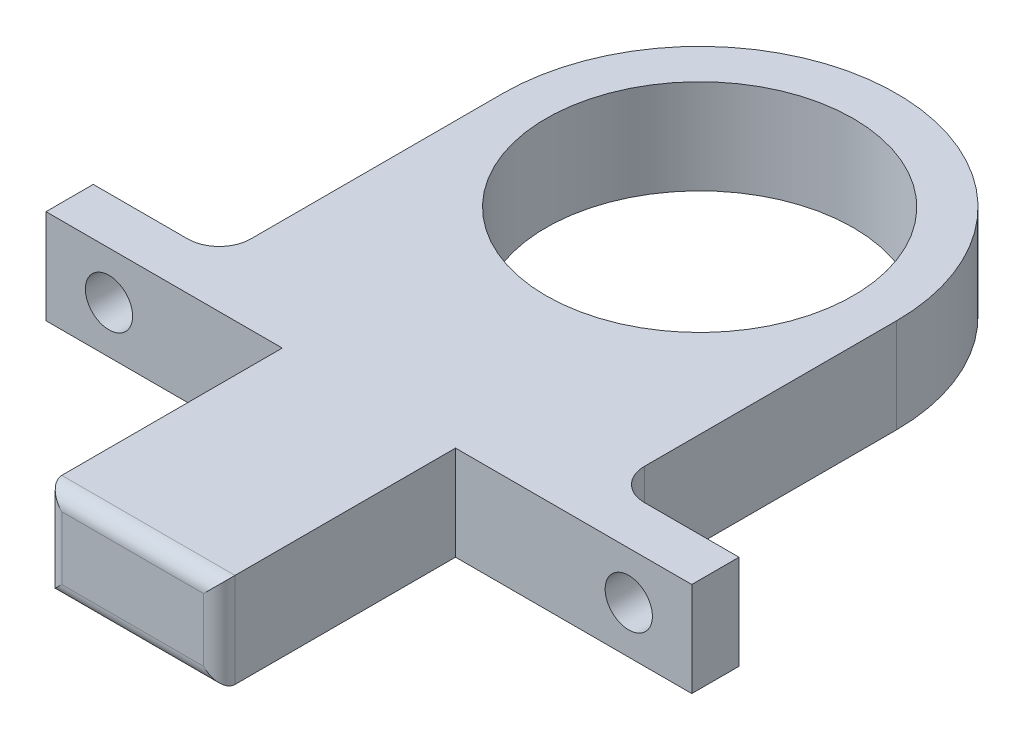
ISO-10303-21;
HEADER;
FILE_DESCRIPTION(('STEP AP214'),'2;1');
FILE_NAME('part.step','',(''),(''),'','','');
FILE_SCHEMA(('AUTOMOTIVE_DESIGN { 1 0 10303 214 1 1 1 1 }'));
ENDSEC;
DATA;
#1=APPLICATION_CONTEXT('core data for automotive mechanical design processes');
#2=APPLICATION_PROTOCOL_DEFINITION('international standard','automotive_design',2000,#1);
#3=PRODUCT_CONTEXT('',#1,'mechanical');
#4=PRODUCT('Part','Part','',(#3));
#5=PRODUCT_RELATED_PRODUCT_CATEGORY('part','',(#4));
#6=PRODUCT_DEFINITION_FORMATION('','',#4);
#7=PRODUCT_DEFINITION_CONTEXT('part definition',#1,'design');
#8=PRODUCT_DEFINITION('design','',#6,#7);
#9=PRODUCT_DEFINITION_SHAPE('','',#8);
#10=(LENGTH_UNIT() NAMED_UNIT(*) SI_UNIT(.MILLI.,.METRE.));
#11=(NAMED_UNIT(*) PLANE_ANGLE_UNIT() SI_UNIT($,.RADIAN.));
#12=(NAMED_UNIT(*) SI_UNIT($,.STERADIAN.) SOLID_ANGLE_UNIT());
#13=UNCERTAINTY_MEASURE_WITH_UNIT(LENGTH_MEASURE(1.E-05),#10,'distance_accuracy_value','');
#14=(GEOMETRIC_REPRESENTATION_CONTEXT(3) GLOBAL_UNCERTAINTY_ASSIGNED_CONTEXT((#13)) GLOBAL_UNIT_ASSIGNED_CONTEXT((#10,
#11,#12)) REPRESENTATION_CONTEXT('',''));
#15=CARTESIAN_POINT('',(0.,0.,0.));
#16=DIRECTION('',(0.,0.,1.));
#17=DIRECTION('',(1.,0.,0.));
#18=AXIS2_PLACEMENT_3D('',#15,#16,#17);
#19=CARTESIAN_POINT('',(14.5,6.,16.));
#20=DIRECTION('',(0.,-1.,0.));
#21=DIRECTION('',(0.,0.,-1.));
#22=AXIS2_PLACEMENT_3D('',#19,#20,#21);
#23=CYLINDRICAL_SURFACE('',#22,2.);
#24=CARTESIAN_POINT('',(14.5,0.763932022500208,18.));
#25=CARTESIAN_POINT('',(14.4360548230811,0.821114452196651,17.999991001011));
#26=CARTESIAN_POINT('',(14.3746747194877,0.880963558778248,17.9969360380857));
#27=CARTESIAN_POINT('',(14.2575309544641,1.00535526899634,17.9861189862143));
#28=CARTESIAN_POINT('',(14.201757724223,1.0698895410455,17.9783650812312));
#29=CARTESIAN_POINT('',(14.0436299233813,1.269403254821,17.9501723427297));
#30=CARTESIAN_POINT('',(13.9500090538812,1.41070634031406,17.9247828447302));
#31=CARTESIAN_POINT('',(13.7964859030759,1.69085008688568,17.8737436355664));
#32=CARTESIAN_POINT('',(13.734085828235,1.8284115592227,17.8483970285937));
#33=CARTESIAN_POINT('',(13.6304231456783,2.11216111679814,17.801968583353));
#34=CARTESIAN_POINT('',(13.5891595639111,2.25834880416089,17.7808865485842));
#35=CARTESIAN_POINT('',(13.5424444149349,2.4900756745183,17.7559694924004));
#36=CARTESIAN_POINT('',(13.5292266928438,2.57373721422762,17.748632542817));
#37=CARTESIAN_POINT('',(13.5099018193217,2.74214941389093,17.7377671781259));
#38=CARTESIAN_POINT('',(13.5037946607241,2.82690007274712,17.7342387591796));
#39=CARTESIAN_POINT('',(13.4988015755461,2.99661169740436,17.731360497232));
#40=CARTESIAN_POINT('',(13.4999096596755,3.08157243027201,17.7320071885158));
#41=CARTESIAN_POINT('',(13.509312145588,3.25095820228575,17.7374022988605));
#42=CARTESIAN_POINT('',(13.5176061598787,3.33538327006965,17.7421504967527));
#43=CARTESIAN_POINT('',(13.5397620052276,3.49240842726077,17.7544457420635));
#44=CARTESIAN_POINT('',(13.5527933449962,3.56516149030752,17.7615661760176));
#45=CARTESIAN_POINT('',(13.584118008221,3.70927623722187,17.7780525456863));
#46=CARTESIAN_POINT('',(13.6024129711344,3.78063748017411,17.7874191808721));
#47=CARTESIAN_POINT('',(13.6650413131257,3.99231248535498,17.8179718344291));
#48=CARTESIAN_POINT('',(13.717093012055,4.13004212413035,17.8415941468649));
#49=CARTESIAN_POINT('',(13.8473106981414,4.41053543180313,17.8919174442979));
#50=CARTESIAN_POINT('',(13.9276616864121,4.55228238725443,17.9186791253345));
#51=CARTESIAN_POINT('',(14.0649005688885,4.75410782817598,17.9526651833944));
#52=CARTESIAN_POINT('',(14.1133615629979,4.81950905689693,17.962958788252));
#53=CARTESIAN_POINT('',(14.2156612628685,4.94638688699547,17.9803633693212));
#54=CARTESIAN_POINT('',(14.2694953446185,5.00786678958472,17.9874770537309));
#55=CARTESIAN_POINT('',(14.3536727958229,5.09640515774771,17.9948357571476));
#56=CARTESIAN_POINT('',(14.382125595261,5.12514571473681,17.9967350315346));
#57=CARTESIAN_POINT('',(14.4402003405923,5.18148166800703,17.9993170113589));
#58=CARTESIAN_POINT('',(14.4698223948428,5.20907695766524,17.9999996037718));
#59=CARTESIAN_POINT('',(14.5,5.23606797749979,18.));
#60=B_SPLINE_CURVE_WITH_KNOTS('',3,(#24,#25,#26,#27,#28,#29,#30,#31,#32,#33,#34,#35,#36,#37,#38,
#39,#40,#41,#42,#43,#44,#45,#46,#47,#48,#49,#50,#51,#52,#53,#54,#55,#56,#57,#58,#59),
.UNSPECIFIED.,.F.,.F.,(4,2,2,2,2,2,2,2,2,2,2,2,2,2,2,2,2,4),(0.,0.257003095036121,
0.513559859167406,1.02485284203966,1.4828396357824,1.94080532182222,2.19552218723163,
2.45023879591204,2.70474399422835,2.95923546951889,3.18175175856397,3.40433742978967,
3.85003679324152,4.34303172260549,4.58891756679051,4.83459359999334,4.95600984354938,
5.07743736555965),.UNSPECIFIED.);
#61=CARTESIAN_POINT('',(14.5,0.763932022500208,18.));
#62=VERTEX_POINT('',#61);
#63=CARTESIAN_POINT('',(14.5,5.23606797749979,18.));
#64=VERTEX_POINT('',#63);
#65=EDGE_CURVE('E165',#62,#64,#60,.T.);
#66=ORIENTED_EDGE('',*,*,#65,.F.);
#67=DIRECTION('',(0.,-1.,0.));
#68=VECTOR('',#67,1.);
#69=CARTESIAN_POINT('',(14.5,6.,18.));
#70=LINE('',#69,#68);
#71=CARTESIAN_POINT('',(14.5,0.,18.));
#72=VERTEX_POINT('',#71);
#73=EDGE_CURVE('E176',#62,#72,#70,.T.);
#74=ORIENTED_EDGE('',*,*,#73,.T.);
#75=CARTESIAN_POINT('',(14.5,0.,16.));
#76=DIRECTION('',(0.,1.,0.));
#77=DIRECTION('',(0.,0.,1.));
#78=AXIS2_PLACEMENT_3D('',#75,#76,#77);
#79=CIRCLE('',#78,2.);
#80=CARTESIAN_POINT('',(12.5,0.,16.));
#81=VERTEX_POINT('',#80);
#82=EDGE_CURVE('E390',#72,#81,#79,.F.);
#83=ORIENTED_EDGE('',*,*,#82,.T.);
#84=DIRECTION('',(0.,-1.,0.));
#85=VECTOR('',#84,1.);
#86=CARTESIAN_POINT('',(12.5,6.,16.));
#87=LINE('',#86,#85);
#88=CARTESIAN_POINT('',(12.5,6.,16.));
#89=VERTEX_POINT('',#88);
#90=EDGE_CURVE('E186',#89,#81,#87,.T.);
#91=ORIENTED_EDGE('',*,*,#90,.F.);
#92=CARTESIAN_POINT('',(14.5,6.,16.));
#93=DIRECTION('',(0.,1.,0.));
#94=DIRECTION('',(0.,0.,1.));
#95=AXIS2_PLACEMENT_3D('',#92,#93,#94);
#96=CIRCLE('',#95,2.);
#97=CARTESIAN_POINT('',(14.5,6.,18.));
#98=VERTEX_POINT('',#97);
#99=EDGE_CURVE('E364',#98,#89,#96,.F.);
#100=ORIENTED_EDGE('',*,*,#99,.F.);
#101=EDGE_CURVE('E179',#98,#64,#70,.T.);
#102=ORIENTED_EDGE('',*,*,#101,.T.);
#103=EDGE_LOOP('',(#66,#74,#83,#91,#100,#102));
#104=FACE_BOUND('',#103,.T.);
#105=ADVANCED_FACE('F35',(#104),#23,.F.);
#106=CARTESIAN_POINT('',(-14.5,6.,16.));
#107=DIRECTION('',(0.,-1.,0.));
#108=DIRECTION('',(0.,0.,-1.));
#109=AXIS2_PLACEMENT_3D('',#106,#107,#108);
#110=CYLINDRICAL_SURFACE('',#109,2.);
#111=DIRECTION('',(0.,-1.,0.));
#112=VECTOR('',#111,1.);
#113=CARTESIAN_POINT('',(-14.5,6.,18.));
#114=LINE('',#113,#112);
#115=CARTESIAN_POINT('',(-14.5,0.76393202250021,18.));
#116=VERTEX_POINT('',#115);
#117=CARTESIAN_POINT('',(-14.5,0.,18.));
#118=VERTEX_POINT('',#117);
#119=EDGE_CURVE('E202',#116,#118,#114,.T.);
#120=ORIENTED_EDGE('',*,*,#119,.F.);
#121=CARTESIAN_POINT('',(-14.5,0.763932022500211,18.));
#122=CARTESIAN_POINT('',(-14.4360548230811,0.821114452196653,17.999991001011));
#123=CARTESIAN_POINT('',(-14.3746747194877,0.88096355877825,17.9969360380857));
#124=CARTESIAN_POINT('',(-14.2575309544641,1.00535526899635,17.9861189862143));
#125=CARTESIAN_POINT('',(-14.201757724223,1.0698895410455,17.9783650812312));
#126=CARTESIAN_POINT('',(-14.0436299233813,1.269403254821,17.9501723427297));
#127=CARTESIAN_POINT('',(-13.9500090538812,1.41070634031406,17.9247828447302));
#128=CARTESIAN_POINT('',(-13.7964859030759,1.69085008688568,17.8737436355664));
#129=CARTESIAN_POINT('',(-13.734085828235,1.8284115592227,17.8483970285937));
#130=CARTESIAN_POINT('',(-13.6304231456783,2.11216111679815,17.801968583353));
#131=CARTESIAN_POINT('',(-13.5891595639111,2.2583488041609,17.7808865485842));
#132=CARTESIAN_POINT('',(-13.5424444149349,2.4900756745183,17.7559694924004));
#133=CARTESIAN_POINT('',(-13.5292266928438,2.57373721422762,17.748632542817));
#134=CARTESIAN_POINT('',(-13.5099018193217,2.74214941389093,17.7377671781259));
#135=CARTESIAN_POINT('',(-13.5037946607241,2.82690007274712,17.7342387591796));
#136=CARTESIAN_POINT('',(-13.4988015755461,2.99661169740436,17.731360497232));
#137=CARTESIAN_POINT('',(-13.4999096596755,3.08157243027202,17.7320071885158));
#138=CARTESIAN_POINT('',(-13.509312145588,3.25095820228576,17.7374022988605));
#139=CARTESIAN_POINT('',(-13.5176061598787,3.33538327006965,17.7421504967527));
#140=CARTESIAN_POINT('',(-13.5397620052276,3.49240842726077,17.7544457420635));
#141=CARTESIAN_POINT('',(-13.5527933449962,3.56516149030752,17.7615661760176));
#142=CARTESIAN_POINT('',(-13.584118008221,3.70927623722188,17.7780525456863));
#143=CARTESIAN_POINT('',(-13.6024129711344,3.78063748017412,17.7874191808721));
#144=CARTESIAN_POINT('',(-13.6650413131257,3.99231248535499,17.8179718344291));
#145=CARTESIAN_POINT('',(-13.717093012055,4.13004212413036,17.8415941468649));
#146=CARTESIAN_POINT('',(-13.8473106981414,4.41053543180314,17.8919174442979));
#147=CARTESIAN_POINT('',(-13.9276616864121,4.55228238725444,17.9186791253345));
#148=CARTESIAN_POINT('',(-14.0649005688885,4.75410782817598,17.9526651833944));
#149=CARTESIAN_POINT('',(-14.1133615629979,4.81950905689693,17.962958788252));
#150=CARTESIAN_POINT('',(-14.2156612628685,4.94638688699547,17.9803633693212));
#151=CARTESIAN_POINT('',(-14.2694953446185,5.00786678958472,17.9874770537309));
#152=CARTESIAN_POINT('',(-14.3536727958229,5.09640515774772,17.9948357571476));
#153=CARTESIAN_POINT('',(-14.382125595261,5.12514571473681,17.9967350315346));
#154=CARTESIAN_POINT('',(-14.4402003405923,5.18148166800703,17.9993170113589));
#155=CARTESIAN_POINT('',(-14.4698223948428,5.20907695766524,17.9999996037718));
#156=CARTESIAN_POINT('',(-14.5,5.23606797749979,18.));
#157=B_SPLINE_CURVE_WITH_KNOTS('',3,(#121,#122,#123,#124,#125,#126,#127,#128,#129,#130,#131,
#132,#133,#134,#135,#136,#137,#138,#139,#140,#141,#142,#143,#144,#145,#146,#147,#148,#149,#150,
#151,#152,#153,#154,#155,#156),.UNSPECIFIED.,.F.,.F.,(4,2,2,2,2,2,2,2,2,2,2,2,2,2,2,2,2,4),(0.,
0.257003095036121,0.513559859167407,1.02485284203966,1.4828396357824,1.94080532182222,
2.19552218723163,2.45023879591204,2.70474399422835,2.95923546951889,3.18175175856396,
3.40433742978967,3.85003679324152,4.34303172260549,4.58891756679051,4.83459359999334,
4.95600984354938,5.07743736555964),.UNSPECIFIED.);
#158=CARTESIAN_POINT('',(-14.5,5.23606797749979,18.));
#159=VERTEX_POINT('',#158);
#160=EDGE_CURVE('E170',#116,#159,#157,.T.);
#161=ORIENTED_EDGE('',*,*,#160,.T.);
#162=CARTESIAN_POINT('',(-14.5,6.,18.));
#163=VERTEX_POINT('',#162);
#164=EDGE_CURVE('E203',#163,#159,#114,.T.);
#165=ORIENTED_EDGE('',*,*,#164,.F.);
#166=CARTESIAN_POINT('',(-14.5,6.,16.));
#167=DIRECTION('',(0.,1.,0.));
#168=DIRECTION('',(0.,0.,1.));
#169=AXIS2_PLACEMENT_3D('',#166,#167,#168);
#170=CIRCLE('',#169,2.);
#171=CARTESIAN_POINT('',(-12.5,6.,16.));
#172=VERTEX_POINT('',#171);
#173=EDGE_CURVE('E349',#163,#172,#170,.T.);
#174=ORIENTED_EDGE('',*,*,#173,.T.);
#175=DIRECTION('',(0.,-1.,0.));
#176=VECTOR('',#175,1.);
#177=CARTESIAN_POINT('',(-12.5,6.,16.));
#178=LINE('',#177,#176);
#179=CARTESIAN_POINT('',(-12.5,0.,16.));
#180=VERTEX_POINT('',#179);
#181=EDGE_CURVE('E206',#172,#180,#178,.T.);
#182=ORIENTED_EDGE('',*,*,#181,.T.);
#183=CARTESIAN_POINT('',(-14.5,0.,16.));
#184=DIRECTION('',(0.,1.,0.));
#185=DIRECTION('',(0.,0.,1.));
#186=AXIS2_PLACEMENT_3D('',#183,#184,#185);
#187=CIRCLE('',#186,2.);
#188=EDGE_CURVE('E375',#118,#180,#187,.T.);
#189=ORIENTED_EDGE('',*,*,#188,.F.);
#190=EDGE_LOOP('',(#120,#161,#165,#174,#182,#189));
#191=FACE_BOUND('',#190,.T.);
#192=ADVANCED_FACE('F272',(#191),#110,.F.);
#193=CARTESIAN_POINT('',(0.,6.,0.));
#194=DIRECTION('',(0.,-1.,0.));
#195=DIRECTION('',(0.,0.,-1.));
#196=AXIS2_PLACEMENT_3D('',#193,#194,#195);
#197=CYLINDRICAL_SURFACE('',#196,9.75);
#198=CARTESIAN_POINT('',(0.,6.,0.));
#199=DIRECTION('',(0.,1.,0.));
#200=DIRECTION('',(0.,0.,1.));
#201=AXIS2_PLACEMENT_3D('',#198,#199,#200);
#202=CIRCLE('',#201,9.75);
#203=CARTESIAN_POINT('',(0.,6.,9.75));
#204=VERTEX_POINT('',#203);
#205=EDGE_CURVE('E189',#204,#204,#202,.T.);
#206=ORIENTED_EDGE('',*,*,#205,.T.);
#207=EDGE_LOOP('',(#206));
#208=FACE_BOUND('',#207,.T.);
#209=CARTESIAN_POINT('',(0.,0.,0.));
#210=DIRECTION('',(0.,1.,0.));
#211=DIRECTION('',(0.,0.,1.));
#212=AXIS2_PLACEMENT_3D('',#209,#210,#211);
#213=CIRCLE('',#212,9.75);
#214=CARTESIAN_POINT('',(0.,0.,9.75));
#215=VERTEX_POINT('',#214);
#216=EDGE_CURVE('E345',#215,#215,#213,.T.);
#217=ORIENTED_EDGE('',*,*,#216,.F.);
#218=EDGE_LOOP('',(#217));
#219=FACE_BOUND('',#218,.T.);
#220=ADVANCED_FACE('F300',(#208,#219),#197,.F.);
#221=CARTESIAN_POINT('',(0.,6.,18.));
#222=DIRECTION('',(0.,0.,1.));
#223=DIRECTION('',(1.,0.,0.));
#224=AXIS2_PLACEMENT_3D('',#221,#222,#223);
#225=PLANE('',#224);
#226=DIRECTION('',(-1.,0.,0.));
#227=VECTOR('',#226,1.);
#228=CARTESIAN_POINT('',(0.,0.,18.));
#229=LINE('',#228,#227);
#230=CARTESIAN_POINT('',(20.5,0.,18.));
#231=VERTEX_POINT('',#230);
#232=EDGE_CURVE('E185',#231,#72,#229,.T.);
#233=ORIENTED_EDGE('',*,*,#232,.T.);
#234=ORIENTED_EDGE('',*,*,#73,.F.);
#235=CARTESIAN_POINT('',(16.5,3.,18.));
#236=DIRECTION('',(0.,0.,-1.));
#237=DIRECTION('',(-1.,0.,0.));
#238=AXIS2_PLACEMENT_3D('',#235,#236,#237);
#239=CIRCLE('',#238,3.);
#240=EDGE_CURVE('E162',#62,#64,#239,.T.);
#241=ORIENTED_EDGE('',*,*,#240,.T.);
#242=ORIENTED_EDGE('',*,*,#101,.F.);
#243=DIRECTION('',(-1.,0.,0.));
#244=VECTOR('',#243,1.);
#245=CARTESIAN_POINT('',(0.,6.,18.));
#246=LINE('',#245,#244);
#247=CARTESIAN_POINT('',(20.5,6.,18.));
#248=VERTEX_POINT('',#247);
#249=EDGE_CURVE('E362',#248,#98,#246,.T.);
#250=ORIENTED_EDGE('',*,*,#249,.F.);
#251=DIRECTION('',(0.,-1.,0.));
#252=VECTOR('',#251,1.);
#253=CARTESIAN_POINT('',(20.5,6.,18.));
#254=LINE('',#253,#252);
#255=EDGE_CURVE('E188',#248,#231,#254,.T.);
#256=ORIENTED_EDGE('',*,*,#255,.T.);
#257=EDGE_LOOP('',(#233,#234,#241,#242,#250,#256));
#258=FACE_BOUND('',#257,.T.);
#259=CARTESIAN_POINT('',(16.5,3.,18.));
#260=DIRECTION('',(0.,0.,1.));
#261=DIRECTION('',(1.,0.,0.));
#262=AXIS2_PLACEMENT_3D('',#259,#260,#261);
#263=CIRCLE('',#262,1.5);
#264=CARTESIAN_POINT('',(18.,3.,18.));
#265=VERTEX_POINT('',#264);
#266=EDGE_CURVE('E222',#265,#265,#263,.T.);
#267=ORIENTED_EDGE('',*,*,#266,.T.);
#268=EDGE_LOOP('',(#267));
#269=FACE_BOUND('',#268,.T.);
#270=ADVANCED_FACE('F182',(#258,#269),#225,.F.);
#271=CARTESIAN_POINT('',(0.,6.,18.));
#272=DIRECTION('',(0.,0.,-1.));
#273=DIRECTION('',(-1.,0.,0.));
#274=AXIS2_PLACEMENT_3D('',#271,#272,#273);
#275=PLANE('',#274);
#276=DIRECTION('',(1.,0.,0.));
#277=VECTOR('',#276,1.);
#278=CARTESIAN_POINT('',(0.,6.,18.));
#279=LINE('',#278,#277);
#280=CARTESIAN_POINT('',(-20.5,6.,18.));
#281=VERTEX_POINT('',#280);
#282=EDGE_CURVE('E329',#281,#163,#279,.T.);
#283=ORIENTED_EDGE('',*,*,#282,.T.);
#284=ORIENTED_EDGE('',*,*,#164,.T.);
#285=CARTESIAN_POINT('',(-16.5,3.,18.));
#286=DIRECTION('',(0.,0.,-1.));
#287=DIRECTION('',(-1.,0.,0.));
#288=AXIS2_PLACEMENT_3D('',#285,#286,#287);
#289=CIRCLE('',#288,3.);
#290=EDGE_CURVE('E171',#159,#116,#289,.T.);
#291=ORIENTED_EDGE('',*,*,#290,.T.);
#292=ORIENTED_EDGE('',*,*,#119,.T.);
#293=DIRECTION('',(1.,0.,0.));
#294=VECTOR('',#293,1.);
#295=CARTESIAN_POINT('',(0.,0.,18.));
#296=LINE('',#295,#294);
#297=CARTESIAN_POINT('',(-20.5,0.,18.));
#298=VERTEX_POINT('',#297);
#299=EDGE_CURVE('E378',#298,#118,#296,.T.);
#300=ORIENTED_EDGE('',*,*,#299,.F.);
#301=DIRECTION('',(0.,-1.,0.));
#302=VECTOR('',#301,1.);
#303=CARTESIAN_POINT('',(-20.5,6.,18.));
#304=LINE('',#303,#302);
#305=EDGE_CURVE('E200',#281,#298,#304,.T.);
#306=ORIENTED_EDGE('',*,*,#305,.F.);
#307=EDGE_LOOP('',(#283,#284,#291,#292,#300,#306));
#308=FACE_BOUND('',#307,.T.);
#309=CARTESIAN_POINT('',(-16.5,3.,18.));
#310=DIRECTION('',(0.,0.,-1.));
#311=DIRECTION('',(-1.,0.,0.));
#312=AXIS2_PLACEMENT_3D('',#309,#310,#311);
#313=CIRCLE('',#312,1.5);
#314=CARTESIAN_POINT('',(-18.,3.,18.));
#315=VERTEX_POINT('',#314);
#316=EDGE_CURVE('E333',#315,#315,#313,.T.);
#317=ORIENTED_EDGE('',*,*,#316,.F.);
#318=EDGE_LOOP('',(#317));
#319=FACE_BOUND('',#318,.T.);
#320=ADVANCED_FACE('F308',(#308,#319),#275,.T.);
#321=CARTESIAN_POINT('',(-12.5,6.,0.));
#322=DIRECTION('',(1.,0.,0.));
#323=DIRECTION('',(0.,0.,-1.));
#324=AXIS2_PLACEMENT_3D('',#321,#322,#323);
#325=PLANE('',#324);
#326=DIRECTION('',(0.,0.,1.));
#327=VECTOR('',#326,1.);
#328=CARTESIAN_POINT('',(-12.5,0.,0.));
#329=LINE('',#328,#327);
#330=CARTESIAN_POINT('',(-12.5,0.,0.));
#331=VERTEX_POINT('',#330);
#332=EDGE_CURVE('E372',#331,#180,#329,.T.);
#333=ORIENTED_EDGE('',*,*,#332,.T.);
#334=ORIENTED_EDGE('',*,*,#181,.F.);
#335=DIRECTION('',(0.,0.,1.));
#336=VECTOR('',#335,1.);
#337=CARTESIAN_POINT('',(-12.5,6.,0.));
#338=LINE('',#337,#336);
#339=CARTESIAN_POINT('',(-12.5,6.,0.));
#340=VERTEX_POINT('',#339);
#341=EDGE_CURVE('E347',#340,#172,#338,.T.);
#342=ORIENTED_EDGE('',*,*,#341,.F.);
#343=DIRECTION('',(0.,-1.,0.));
#344=VECTOR('',#343,1.);
#345=CARTESIAN_POINT('',(-12.5,6.,0.));
#346=LINE('',#345,#344);
#347=EDGE_CURVE('E208',#340,#331,#346,.T.);
#348=ORIENTED_EDGE('',*,*,#347,.T.);
#349=EDGE_LOOP('',(#333,#334,#342,#348));
#350=FACE_BOUND('',#349,.T.);
#351=ADVANCED_FACE('F321',(#350),#325,.F.);
#352=CARTESIAN_POINT('',(0.,6.,0.));
#353=DIRECTION('',(0.,-1.,0.));
#354=DIRECTION('',(0.,0.,-1.));
#355=AXIS2_PLACEMENT_3D('',#352,#353,#354);
#356=CYLINDRICAL_SURFACE('',#355,12.5);
#357=CARTESIAN_POINT('',(0.,0.,0.));
#358=DIRECTION('',(0.,1.,0.));
#359=DIRECTION('',(0.,0.,1.));
#360=AXIS2_PLACEMENT_3D('',#357,#358,#359);
#361=CIRCLE('',#360,12.5);
#362=CARTESIAN_POINT('',(12.5,0.,0.));
#363=VERTEX_POINT('',#362);
#364=EDGE_CURVE('E370',#363,#331,#361,.T.);
#365=ORIENTED_EDGE('',*,*,#364,.T.);
#366=ORIENTED_EDGE('',*,*,#347,.F.);
#367=CARTESIAN_POINT('',(0.,6.,0.));
#368=DIRECTION('',(0.,1.,0.));
#369=DIRECTION('',(0.,0.,1.));
#370=AXIS2_PLACEMENT_3D('',#367,#368,#369);
#371=CIRCLE('',#370,12.5);
#372=CARTESIAN_POINT('',(12.5,6.,0.));
#373=VERTEX_POINT('',#372);
#374=EDGE_CURVE('E344',#373,#340,#371,.T.);
#375=ORIENTED_EDGE('',*,*,#374,.F.);
#376=DIRECTION('',(0.,-1.,0.));
#377=VECTOR('',#376,1.);
#378=CARTESIAN_POINT('',(12.5,6.,0.));
#379=LINE('',#378,#377);
#380=EDGE_CURVE('E211',#373,#363,#379,.T.);
#381=ORIENTED_EDGE('',*,*,#380,.T.);
#382=EDGE_LOOP('',(#365,#366,#375,#381));
#383=FACE_BOUND('',#382,.T.);
#384=ADVANCED_FACE('F325',(#383),#356,.T.);
#385=CARTESIAN_POINT('',(12.5,6.,0.));
#386=DIRECTION('',(1.,0.,0.));
#387=DIRECTION('',(0.,0.,-1.));
#388=AXIS2_PLACEMENT_3D('',#385,#386,#387);
#389=PLANE('',#388);
#390=DIRECTION('',(0.,0.,1.));
#391=VECTOR('',#390,1.);
#392=CARTESIAN_POINT('',(12.5,0.,0.));
#393=LINE('',#392,#391);
#394=EDGE_CURVE('E219',#363,#81,#393,.T.);
#395=ORIENTED_EDGE('',*,*,#394,.F.);
#396=ORIENTED_EDGE('',*,*,#380,.F.);
#397=DIRECTION('',(0.,0.,1.));
#398=VECTOR('',#397,1.);
#399=CARTESIAN_POINT('',(12.5,6.,0.));
#400=LINE('',#399,#398);
#401=EDGE_CURVE('E341',#373,#89,#400,.T.);
#402=ORIENTED_EDGE('',*,*,#401,.T.);
#403=ORIENTED_EDGE('',*,*,#90,.T.);
#404=EDGE_LOOP('',(#395,#396,#402,#403));
#405=FACE_BOUND('',#404,.T.);
#406=ADVANCED_FACE('F318',(#405),#389,.T.);
#407=CARTESIAN_POINT('',(-20.5,6.,0.));
#408=DIRECTION('',(1.,0.,0.));
#409=DIRECTION('',(0.,0.,-1.));
#410=AXIS2_PLACEMENT_3D('',#407,#408,#409);
#411=PLANE('',#410);
#412=DIRECTION('',(0.,0.,1.));
#413=VECTOR('',#412,1.);
#414=CARTESIAN_POINT('',(-20.5,0.,0.));
#415=LINE('',#414,#413);
#416=CARTESIAN_POINT('',(-20.5,0.,21.));
#417=VERTEX_POINT('',#416);
#418=EDGE_CURVE('E380',#298,#417,#415,.T.);
#419=ORIENTED_EDGE('',*,*,#418,.T.);
#420=DIRECTION('',(0.,-1.,0.));
#421=VECTOR('',#420,1.);
#422=CARTESIAN_POINT('',(-20.5,6.,21.));
#423=LINE('',#422,#421);
#424=CARTESIAN_POINT('',(-20.5,6.,21.));
#425=VERTEX_POINT('',#424);
#426=EDGE_CURVE('E197',#425,#417,#423,.T.);
#427=ORIENTED_EDGE('',*,*,#426,.F.);
#428=DIRECTION('',(0.,0.,1.));
#429=VECTOR('',#428,1.);
#430=CARTESIAN_POINT('',(-20.5,6.,0.));
#431=LINE('',#430,#429);
#432=EDGE_CURVE('E353',#281,#425,#431,.T.);
#433=ORIENTED_EDGE('',*,*,#432,.F.);
#434=ORIENTED_EDGE('',*,*,#305,.T.);
#435=EDGE_LOOP('',(#419,#427,#433,#434));
#436=FACE_BOUND('',#435,.T.);
#437=ADVANCED_FACE('F311',(#436),#411,.F.);
#438=CARTESIAN_POINT('',(20.5,6.,0.));
#439=DIRECTION('',(1.,0.,0.));
#440=DIRECTION('',(0.,0.,-1.));
#441=AXIS2_PLACEMENT_3D('',#438,#439,#440);
#442=PLANE('',#441);
#443=DIRECTION('',(0.,0.,1.));
#444=VECTOR('',#443,1.);
#445=CARTESIAN_POINT('',(20.5,0.,0.));
#446=LINE('',#445,#444);
#447=CARTESIAN_POINT('',(20.5,0.,21.));
#448=VERTEX_POINT('',#447);
#449=EDGE_CURVE('E386',#231,#448,#446,.T.);
#450=ORIENTED_EDGE('',*,*,#449,.F.);
#451=ORIENTED_EDGE('',*,*,#255,.F.);
#452=DIRECTION('',(0.,0.,1.));
#453=VECTOR('',#452,1.);
#454=CARTESIAN_POINT('',(20.5,6.,0.));
#455=LINE('',#454,#453);
#456=CARTESIAN_POINT('',(20.5,6.,21.));
#457=VERTEX_POINT('',#456);
#458=EDGE_CURVE('E359',#248,#457,#455,.T.);
#459=ORIENTED_EDGE('',*,*,#458,.T.);
#460=DIRECTION('',(0.,-1.,0.));
#461=VECTOR('',#460,1.);
#462=CARTESIAN_POINT('',(20.5,6.,21.));
#463=LINE('',#462,#461);
#464=EDGE_CURVE('E194',#457,#448,#463,.T.);
#465=ORIENTED_EDGE('',*,*,#464,.T.);
#466=EDGE_LOOP('',(#450,#451,#459,#465));
#467=FACE_BOUND('',#466,.T.);
#468=ADVANCED_FACE('F298',(#467),#442,.T.);
#469=CARTESIAN_POINT('',(0.,0.,0.));
#470=DIRECTION('',(0.,1.,0.));
#471=DIRECTION('',(0.,0.,1.));
#472=AXIS2_PLACEMENT_3D('',#469,#470,#471);
#473=PLANE('',#472);
#474=DIRECTION('',(0.,0.,1.));
#475=VECTOR('',#474,1.);
#476=CARTESIAN_POINT('',(5.5,0.,21.));
#477=LINE('',#476,#475);
#478=CARTESIAN_POINT('',(5.5,0.,21.));
#479=VERTEX_POINT('',#478);
#480=CARTESIAN_POINT('',(5.50000000000001,0.,35.));
#481=VERTEX_POINT('',#480);
#482=EDGE_CURVE('E220',#479,#481,#477,.T.);
#483=ORIENTED_EDGE('',*,*,#482,.T.);
#484=DIRECTION('',(1.,0.,0.));
#485=VECTOR('',#484,1.);
#486=CARTESIAN_POINT('',(0.,0.,35.));
#487=LINE('',#486,#485);
#488=CARTESIAN_POINT('',(-5.49999999999999,0.,35.));
#489=VERTEX_POINT('',#488);
#490=EDGE_CURVE('E11',#481,#489,#487,.F.);
#491=ORIENTED_EDGE('',*,*,#490,.T.);
#492=DIRECTION('',(0.,0.,1.));
#493=VECTOR('',#492,1.);
#494=CARTESIAN_POINT('',(-5.5,0.,21.));
#495=LINE('',#494,#493);
#496=CARTESIAN_POINT('',(-5.5,0.,21.));
#497=VERTEX_POINT('',#496);
#498=EDGE_CURVE('E217',#497,#489,#495,.T.);
#499=ORIENTED_EDGE('',*,*,#498,.F.);
#500=DIRECTION('',(1.,0.,0.));
#501=VECTOR('',#500,1.);
#502=CARTESIAN_POINT('',(0.,0.,21.));
#503=LINE('',#502,#501);
#504=EDGE_CURVE('E383',#417,#497,#503,.T.);
#505=ORIENTED_EDGE('',*,*,#504,.F.);
#506=ORIENTED_EDGE('',*,*,#418,.F.);
#507=ORIENTED_EDGE('',*,*,#299,.T.);
#508=ORIENTED_EDGE('',*,*,#188,.T.);
#509=ORIENTED_EDGE('',*,*,#332,.F.);
#510=ORIENTED_EDGE('',*,*,#364,.F.);
#511=ORIENTED_EDGE('',*,*,#394,.T.);
#512=ORIENTED_EDGE('',*,*,#82,.F.);
#513=ORIENTED_EDGE('',*,*,#232,.F.);
#514=ORIENTED_EDGE('',*,*,#449,.T.);
#515=EDGE_CURVE('E382',#479,#448,#503,.T.);
#516=ORIENTED_EDGE('',*,*,#515,.F.);
#517=EDGE_LOOP('',(#483,#491,#499,#505,#506,#507,#508,#509,#510,#511,#512,#513,#514,#516));
#518=FACE_BOUND('',#517,.T.);
#519=ORIENTED_EDGE('',*,*,#216,.T.);
#520=EDGE_LOOP('',(#519));
#521=FACE_BOUND('',#520,.T.);
#522=ADVANCED_FACE('F295',(#518,#521),#473,.F.);
#523=CARTESIAN_POINT('',(0.,6.,0.));
#524=DIRECTION('',(0.,1.,0.));
#525=DIRECTION('',(0.,0.,1.));
#526=AXIS2_PLACEMENT_3D('',#523,#524,#525);
#527=PLANE('',#526);
#528=DIRECTION('',(0.,0.,1.));
#529=VECTOR('',#528,1.);
#530=CARTESIAN_POINT('',(-5.5,6.,21.));
#531=LINE('',#530,#529);
#532=CARTESIAN_POINT('',(-5.5,6.,21.));
#533=VERTEX_POINT('',#532);
#534=CARTESIAN_POINT('',(-5.49999999999999,6.,35.));
#535=VERTEX_POINT('',#534);
#536=EDGE_CURVE('E216',#533,#535,#531,.T.);
#537=ORIENTED_EDGE('',*,*,#536,.T.);
#538=DIRECTION('',(1.,0.,0.));
#539=VECTOR('',#538,1.);
#540=CARTESIAN_POINT('',(5.50000000000001,6.,35.));
#541=LINE('',#540,#539);
#542=CARTESIAN_POINT('',(5.50000000000001,6.,35.));
#543=VERTEX_POINT('',#542);
#544=EDGE_CURVE('E59',#535,#543,#541,.T.);
#545=ORIENTED_EDGE('',*,*,#544,.T.);
#546=DIRECTION('',(0.,0.,1.));
#547=VECTOR('',#546,1.);
#548=CARTESIAN_POINT('',(5.5,6.,21.));
#549=LINE('',#548,#547);
#550=CARTESIAN_POINT('',(5.5,6.,21.));
#551=VERTEX_POINT('',#550);
#552=EDGE_CURVE('E214',#551,#543,#549,.T.);
#553=ORIENTED_EDGE('',*,*,#552,.F.);
#554=DIRECTION('',(1.,0.,0.));
#555=VECTOR('',#554,1.);
#556=CARTESIAN_POINT('',(0.,6.,21.));
#557=LINE('',#556,#555);
#558=EDGE_CURVE('E355',#551,#457,#557,.T.);
#559=ORIENTED_EDGE('',*,*,#558,.T.);
#560=ORIENTED_EDGE('',*,*,#458,.F.);
#561=ORIENTED_EDGE('',*,*,#249,.T.);
#562=ORIENTED_EDGE('',*,*,#99,.T.);
#563=ORIENTED_EDGE('',*,*,#401,.F.);
#564=ORIENTED_EDGE('',*,*,#374,.T.);
#565=ORIENTED_EDGE('',*,*,#341,.T.);
#566=ORIENTED_EDGE('',*,*,#173,.F.);
#567=ORIENTED_EDGE('',*,*,#282,.F.);
#568=ORIENTED_EDGE('',*,*,#432,.T.);
#569=EDGE_CURVE('E356',#425,#533,#557,.T.);
#570=ORIENTED_EDGE('',*,*,#569,.T.);
#571=EDGE_LOOP('',(#537,#545,#553,#559,#560,#561,#562,#563,#564,#565,#566,#567,#568,#570));
#572=FACE_BOUND('',#571,.T.);
#573=ORIENTED_EDGE('',*,*,#205,.F.);
#574=EDGE_LOOP('',(#573));
#575=FACE_BOUND('',#574,.T.);
#576=ADVANCED_FACE('F291',(#572,#575),#527,.T.);
#577=CARTESIAN_POINT('',(0.,6.,21.));
#578=DIRECTION('',(0.,0.,-1.));
#579=DIRECTION('',(-1.,0.,0.));
#580=AXIS2_PLACEMENT_3D('',#577,#578,#579);
#581=PLANE('',#580);
#582=CARTESIAN_POINT('',(16.5,3.,21.));
#583=DIRECTION('',(0.,0.,1.));
#584=DIRECTION('',(1.,0.,0.));
#585=AXIS2_PLACEMENT_3D('',#582,#583,#584);
#586=CIRCLE('',#585,1.5);
#587=CARTESIAN_POINT('',(18.,3.,21.));
#588=VERTEX_POINT('',#587);
#589=EDGE_CURVE('E180',#588,#588,#586,.T.);
#590=ORIENTED_EDGE('',*,*,#589,.F.);
#591=EDGE_LOOP('',(#590));
#592=FACE_BOUND('',#591,.T.);
#593=ORIENTED_EDGE('',*,*,#558,.F.);
#594=DIRECTION('',(0.,-1.,0.));
#595=VECTOR('',#594,1.);
#596=CARTESIAN_POINT('',(5.5,6.,21.));
#597=LINE('',#596,#595);
#598=EDGE_CURVE('E213',#551,#479,#597,.T.);
#599=ORIENTED_EDGE('',*,*,#598,.T.);
#600=ORIENTED_EDGE('',*,*,#515,.T.);
#601=ORIENTED_EDGE('',*,*,#464,.F.);
#602=EDGE_LOOP('',(#593,#599,#600,#601));
#603=FACE_BOUND('',#602,.T.);
#604=ADVANCED_FACE('F294',(#592,#603),#581,.F.);
#605=CARTESIAN_POINT('',(-16.5,3.,21.));
#606=DIRECTION('',(0.,0.,1.));
#607=DIRECTION('',(1.,0.,0.));
#608=AXIS2_PLACEMENT_3D('',#605,#606,#607);
#609=CIRCLE('',#608,1.5);
#610=CARTESIAN_POINT('',(-15.,3.,21.));
#611=VERTEX_POINT('',#610);
#612=EDGE_CURVE('E334',#611,#611,#609,.T.);
#613=ORIENTED_EDGE('',*,*,#612,.F.);
#614=EDGE_LOOP('',(#613));
#615=FACE_BOUND('',#614,.T.);
#616=DIRECTION('',(0.,-1.,0.));
#617=VECTOR('',#616,1.);
#618=CARTESIAN_POINT('',(-5.5,6.,21.));
#619=LINE('',#618,#617);
#620=EDGE_CURVE('E225',#533,#497,#619,.T.);
#621=ORIENTED_EDGE('',*,*,#620,.F.);
#622=ORIENTED_EDGE('',*,*,#569,.F.);
#623=ORIENTED_EDGE('',*,*,#426,.T.);
#624=ORIENTED_EDGE('',*,*,#504,.T.);
#625=EDGE_LOOP('',(#621,#622,#623,#624));
#626=FACE_BOUND('',#625,.T.);
#627=ADVANCED_FACE('F315',(#615,#626),#581,.F.);
#628=CARTESIAN_POINT('',(-5.49999999999999,6.,36.));
#629=DIRECTION('',(0.,0.,-1.));
#630=DIRECTION('',(-1.,0.,0.));
#631=AXIS2_PLACEMENT_3D('',#628,#629,#630);
#632=PLANE('',#631);
#633=DIRECTION('',(1.,0.,0.));
#634=VECTOR('',#633,1.);
#635=CARTESIAN_POINT('',(-5.49999999999999,5.,36.));
#636=LINE('',#635,#634);
#637=CARTESIAN_POINT('',(4.5,5.,36.));
#638=VERTEX_POINT('',#637);
#639=CARTESIAN_POINT('',(-4.49999999999999,5.,36.));
#640=VERTEX_POINT('',#639);
#641=EDGE_CURVE('E232',#638,#640,#636,.F.);
#642=ORIENTED_EDGE('',*,*,#641,.T.);
#643=DIRECTION('',(0.,-1.,0.));
#644=VECTOR('',#643,1.);
#645=CARTESIAN_POINT('',(-4.49999999999999,6.,36.));
#646=LINE('',#645,#644);
#647=CARTESIAN_POINT('',(-4.49999999999999,1.,36.));
#648=VERTEX_POINT('',#647);
#649=EDGE_CURVE('E234',#640,#648,#646,.T.);
#650=ORIENTED_EDGE('',*,*,#649,.T.);
#651=DIRECTION('',(1.,0.,0.));
#652=VECTOR('',#651,1.);
#653=CARTESIAN_POINT('',(-5.49999999999999,1.,36.));
#654=LINE('',#653,#652);
#655=CARTESIAN_POINT('',(4.5,1.,36.));
#656=VERTEX_POINT('',#655);
#657=EDGE_CURVE('E227',#648,#656,#654,.T.);
#658=ORIENTED_EDGE('',*,*,#657,.T.);
#659=DIRECTION('',(0.,-1.,0.));
#660=VECTOR('',#659,1.);
#661=CARTESIAN_POINT('',(4.5,6.,36.));
#662=LINE('',#661,#660);
#663=EDGE_CURVE('E230',#656,#638,#662,.F.);
#664=ORIENTED_EDGE('',*,*,#663,.T.);
#665=EDGE_LOOP('',(#642,#650,#658,#664));
#666=FACE_BOUND('',#665,.T.);
#667=ADVANCED_FACE('F448',(#666),#632,.F.);
#668=CARTESIAN_POINT('',(5.5,6.,21.));
#669=DIRECTION('',(1.,0.,0.));
#670=DIRECTION('',(0.,0.,-1.));
#671=AXIS2_PLACEMENT_3D('',#668,#669,#670);
#672=PLANE('',#671);
#673=ORIENTED_EDGE('',*,*,#552,.T.);
#674=DIRECTION('',(0.,-1.,0.));
#675=VECTOR('',#674,1.);
#676=CARTESIAN_POINT('',(5.50000000000001,0.,35.));
#677=LINE('',#676,#675);
#678=EDGE_CURVE('E44',#543,#481,#677,.T.);
#679=ORIENTED_EDGE('',*,*,#678,.T.);
#680=ORIENTED_EDGE('',*,*,#482,.F.);
#681=ORIENTED_EDGE('',*,*,#598,.F.);
#682=EDGE_LOOP('',(#673,#679,#680,#681));
#683=FACE_BOUND('',#682,.T.);
#684=ADVANCED_FACE('F445',(#683),#672,.T.);
#685=CARTESIAN_POINT('',(-5.5,6.,21.));
#686=DIRECTION('',(1.,0.,0.));
#687=DIRECTION('',(0.,0.,-1.));
#688=AXIS2_PLACEMENT_3D('',#685,#686,#687);
#689=PLANE('',#688);
#690=ORIENTED_EDGE('',*,*,#498,.T.);
#691=DIRECTION('',(0.,-1.,0.));
#692=VECTOR('',#691,1.);
#693=CARTESIAN_POINT('',(-5.49999999999999,6.,35.));
#694=LINE('',#693,#692);
#695=EDGE_CURVE('E237',#489,#535,#694,.F.);
#696=ORIENTED_EDGE('',*,*,#695,.T.);
#697=ORIENTED_EDGE('',*,*,#536,.F.);
#698=ORIENTED_EDGE('',*,*,#620,.T.);
#699=EDGE_LOOP('',(#690,#696,#697,#698));
#700=FACE_BOUND('',#699,.T.);
#701=ADVANCED_FACE('F286',(#700),#689,.F.);
#702=CARTESIAN_POINT('',(-16.5,3.,15.));
#703=DIRECTION('',(0.,0.,1.));
#704=DIRECTION('',(1.,0.,0.));
#705=AXIS2_PLACEMENT_3D('',#702,#703,#704);
#706=CYLINDRICAL_SURFACE('',#705,1.5);
#707=ORIENTED_EDGE('',*,*,#316,.T.);
#708=EDGE_LOOP('',(#707));
#709=FACE_BOUND('',#708,.T.);
#710=ORIENTED_EDGE('',*,*,#612,.T.);
#711=EDGE_LOOP('',(#710));
#712=FACE_BOUND('',#711,.T.);
#713=ADVANCED_FACE('F283',(#709,#712),#706,.F.);
#714=CARTESIAN_POINT('',(16.5,3.,15.));
#715=DIRECTION('',(0.,0.,1.));
#716=DIRECTION('',(1.,0.,0.));
#717=AXIS2_PLACEMENT_3D('',#714,#715,#716);
#718=CYLINDRICAL_SURFACE('',#717,1.5);
#719=ORIENTED_EDGE('',*,*,#589,.T.);
#720=EDGE_LOOP('',(#719));
#721=FACE_BOUND('',#720,.T.);
#722=ORIENTED_EDGE('',*,*,#266,.F.);
#723=EDGE_LOOP('',(#722));
#724=FACE_BOUND('',#723,.T.);
#725=ADVANCED_FACE('F280',(#721,#724),#718,.F.);
#726=CARTESIAN_POINT('',(-16.5,3.,12.));
#727=DIRECTION('',(0.,0.,1.));
#728=DIRECTION('',(1.,0.,0.));
#729=AXIS2_PLACEMENT_3D('',#726,#727,#728);
#730=CYLINDRICAL_SURFACE('',#729,3.);
#731=ORIENTED_EDGE('',*,*,#290,.F.);
#732=ORIENTED_EDGE('',*,*,#160,.F.);
#733=EDGE_LOOP('',(#731,#732));
#734=FACE_BOUND('',#733,.T.);
#735=ADVANCED_FACE('F276',(#734),#730,.F.);
#736=CARTESIAN_POINT('',(16.5,3.,12.));
#737=DIRECTION('',(0.,0.,1.));
#738=DIRECTION('',(1.,0.,0.));
#739=AXIS2_PLACEMENT_3D('',#736,#737,#738);
#740=CYLINDRICAL_SURFACE('',#739,3.);
#741=ORIENTED_EDGE('',*,*,#65,.T.);
#742=ORIENTED_EDGE('',*,*,#240,.F.);
#743=EDGE_LOOP('',(#741,#742));
#744=FACE_BOUND('',#743,.T.);
#745=ADVANCED_FACE('F164',(#744),#740,.F.);
#746=CARTESIAN_POINT('',(4.5,6.,35.));
#747=DIRECTION('',(0.,1.,0.));
#748=DIRECTION('',(0.,0.,1.));
#749=AXIS2_PLACEMENT_3D('',#746,#747,#748);
#750=CYLINDRICAL_SURFACE('',#749,1.);
#751=CARTESIAN_POINT('',(4.5,1.,35.));
#752=DIRECTION('',(0.707106781186547,0.707106781186547,0.));
#753=DIRECTION('',(0.707106781186547,-0.707106781186547,0.));
#754=AXIS2_PLACEMENT_3D('',#751,#752,#753);
#755=ELLIPSE('',#754,1.41421356237309,1.);
#756=EDGE_CURVE('E245',#481,#656,#755,.F.);
#757=ORIENTED_EDGE('',*,*,#756,.F.);
#758=ORIENTED_EDGE('',*,*,#678,.F.);
#759=CARTESIAN_POINT('',(4.5,5.,35.));
#760=DIRECTION('',(-0.707106781186547,0.707106781186547,0.));
#761=DIRECTION('',(0.707106781186547,0.707106781186547,0.));
#762=AXIS2_PLACEMENT_3D('',#759,#760,#761);
#763=ELLIPSE('',#762,1.41421356237309,1.);
#764=EDGE_CURVE('E39',#638,#543,#763,.T.);
#765=ORIENTED_EDGE('',*,*,#764,.F.);
#766=ORIENTED_EDGE('',*,*,#663,.F.);
#767=EDGE_LOOP('',(#757,#758,#765,#766));
#768=FACE_BOUND('',#767,.T.);
#769=ADVANCED_FACE('F37',(#768),#750,.T.);
#770=CARTESIAN_POINT('',(0.,5.,35.));
#771=DIRECTION('',(-1.,0.,0.));
#772=DIRECTION('',(0.,0.,1.));
#773=AXIS2_PLACEMENT_3D('',#770,#771,#772);
#774=CYLINDRICAL_SURFACE('',#773,1.);
#775=ORIENTED_EDGE('',*,*,#764,.T.);
#776=ORIENTED_EDGE('',*,*,#544,.F.);
#777=CARTESIAN_POINT('',(-4.49999999999999,5.,35.));
#778=DIRECTION('',(-0.707106781186547,-0.707106781186547,0.));
#779=DIRECTION('',(-0.707106781186547,0.707106781186547,0.));
#780=AXIS2_PLACEMENT_3D('',#777,#778,#779);
#781=ELLIPSE('',#780,1.41421356237309,1.);
#782=EDGE_CURVE('E244',#640,#535,#781,.T.);
#783=ORIENTED_EDGE('',*,*,#782,.F.);
#784=ORIENTED_EDGE('',*,*,#641,.F.);
#785=EDGE_LOOP('',(#775,#776,#783,#784));
#786=FACE_BOUND('',#785,.T.);
#787=ADVANCED_FACE('F455',(#786),#774,.T.);
#788=CARTESIAN_POINT('',(-5.49999999999999,1.,35.));
#789=DIRECTION('',(1.,0.,0.));
#790=DIRECTION('',(0.,0.,-1.));
#791=AXIS2_PLACEMENT_3D('',#788,#789,#790);
#792=CYLINDRICAL_SURFACE('',#791,1.);
#793=ORIENTED_EDGE('',*,*,#756,.T.);
#794=ORIENTED_EDGE('',*,*,#657,.F.);
#795=CARTESIAN_POINT('',(-4.49999999999999,1.,35.));
#796=DIRECTION('',(0.707106781186547,-0.707106781186547,0.));
#797=DIRECTION('',(0.707106781186547,0.707106781186547,0.));
#798=AXIS2_PLACEMENT_3D('',#795,#796,#797);
#799=ELLIPSE('',#798,1.41421356237309,1.);
#800=EDGE_CURVE('E242',#489,#648,#799,.F.);
#801=ORIENTED_EDGE('',*,*,#800,.F.);
#802=ORIENTED_EDGE('',*,*,#490,.F.);
#803=EDGE_LOOP('',(#793,#794,#801,#802));
#804=FACE_BOUND('',#803,.T.);
#805=ADVANCED_FACE('F415',(#804),#792,.T.);
#806=CARTESIAN_POINT('',(-4.49999999999999,6.,35.));
#807=DIRECTION('',(0.,-1.,0.));
#808=DIRECTION('',(0.,0.,-1.));
#809=AXIS2_PLACEMENT_3D('',#806,#807,#808);
#810=CYLINDRICAL_SURFACE('',#809,1.);
#811=ORIENTED_EDGE('',*,*,#782,.T.);
#812=ORIENTED_EDGE('',*,*,#695,.F.);
#813=ORIENTED_EDGE('',*,*,#800,.T.);
#814=ORIENTED_EDGE('',*,*,#649,.F.);
#815=EDGE_LOOP('',(#811,#812,#813,#814));
#816=FACE_BOUND('',#815,.T.);
#817=ADVANCED_FACE('F419',(#816),#810,.T.);
#818=CLOSED_SHELL('',(#105,#192,#220,#270,#320,#351,#384,#406,#437,#468,#522,#576,#604,#627,
#667,#684,#701,#713,#725,#735,#745,#769,#787,#805,#817));
#819=MANIFOLD_SOLID_BREP('B2',#818);
#820=ADVANCED_BREP_SHAPE_REPRESENTATION('',(#18,#819),#14);
#821=SHAPE_DEFINITION_REPRESENTATION(#9,#820);
ENDSEC;
END-ISO-10303-21;
